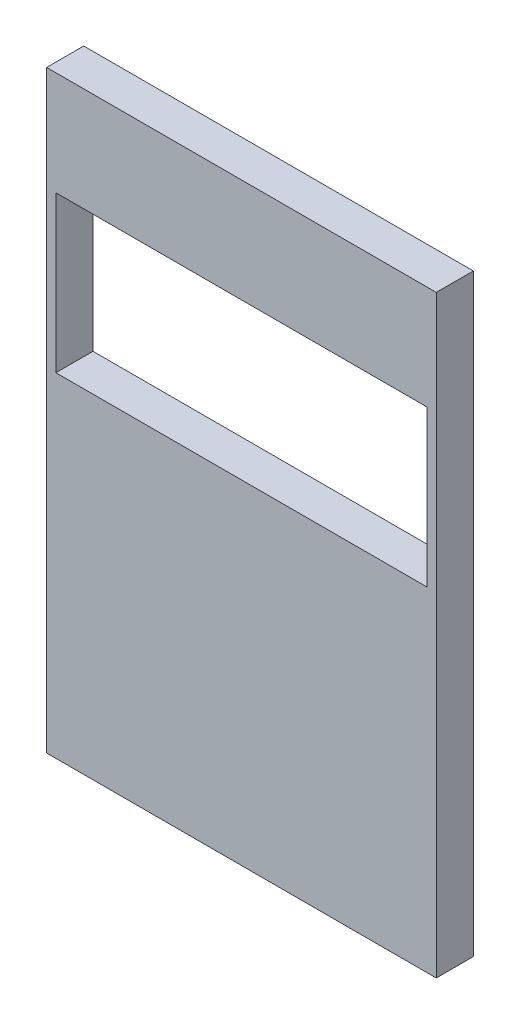
ISO-10303-21;
HEADER;
FILE_DESCRIPTION(('STEP AP214'),'2;1');
FILE_NAME('part.step','',(''),(''),'','','');
FILE_SCHEMA(('AUTOMOTIVE_DESIGN { 1 0 10303 214 1 1 1 1 }'));
ENDSEC;
DATA;
#1=APPLICATION_CONTEXT('core data for automotive mechanical design processes');
#2=APPLICATION_PROTOCOL_DEFINITION('international standard','automotive_design',2000,#1);
#3=PRODUCT_CONTEXT('',#1,'mechanical');
#4=PRODUCT('Part','Part','',(#3));
#5=PRODUCT_RELATED_PRODUCT_CATEGORY('part','',(#4));
#6=PRODUCT_DEFINITION_FORMATION('','',#4);
#7=PRODUCT_DEFINITION_CONTEXT('part definition',#1,'design');
#8=PRODUCT_DEFINITION('design','',#6,#7);
#9=PRODUCT_DEFINITION_SHAPE('','',#8);
#10=(LENGTH_UNIT() NAMED_UNIT(*) SI_UNIT(.MILLI.,.METRE.));
#11=(NAMED_UNIT(*) PLANE_ANGLE_UNIT() SI_UNIT($,.RADIAN.));
#12=(NAMED_UNIT(*) SI_UNIT($,.STERADIAN.) SOLID_ANGLE_UNIT());
#13=UNCERTAINTY_MEASURE_WITH_UNIT(LENGTH_MEASURE(1.E-05),#10,'distance_accuracy_value','');
#14=(GEOMETRIC_REPRESENTATION_CONTEXT(3) GLOBAL_UNCERTAINTY_ASSIGNED_CONTEXT((#13)) GLOBAL_UNIT_ASSIGNED_CONTEXT((#10,
#11,#12)) REPRESENTATION_CONTEXT('',''));
#15=CARTESIAN_POINT('',(0.,0.,0.));
#16=DIRECTION('',(0.,0.,1.));
#17=DIRECTION('',(1.,0.,0.));
#18=AXIS2_PLACEMENT_3D('',#15,#16,#17);
#19=CARTESIAN_POINT('',(-52.5,-80.,10.));
#20=DIRECTION('',(1.,0.,0.));
#21=DIRECTION('',(0.,0.,-1.));
#22=AXIS2_PLACEMENT_3D('',#19,#20,#21);
#23=PLANE('',#22);
#24=DIRECTION('',(0.,-1.,0.));
#25=VECTOR('',#24,1.);
#26=CARTESIAN_POINT('',(-52.5,-80.,0.));
#27=LINE('',#26,#25);
#28=CARTESIAN_POINT('',(-52.5,80.,0.));
#29=VERTEX_POINT('',#28);
#30=CARTESIAN_POINT('',(-52.5,-80.,0.));
#31=VERTEX_POINT('',#30);
#32=EDGE_CURVE('E130',#29,#31,#27,.T.);
#33=ORIENTED_EDGE('',*,*,#32,.T.);
#34=DIRECTION('',(0.,0.,-1.));
#35=VECTOR('',#34,1.);
#36=CARTESIAN_POINT('',(-52.5,-80.,10.));
#37=LINE('',#36,#35);
#38=CARTESIAN_POINT('',(-52.5,-80.,10.));
#39=VERTEX_POINT('',#38);
#40=EDGE_CURVE('E11',#39,#31,#37,.T.);
#41=ORIENTED_EDGE('',*,*,#40,.F.);
#42=DIRECTION('',(0.,-1.,0.));
#43=VECTOR('',#42,1.);
#44=CARTESIAN_POINT('',(-52.5,-80.,10.));
#45=LINE('',#44,#43);
#46=CARTESIAN_POINT('',(-52.5,80.,10.));
#47=VERTEX_POINT('',#46);
#48=EDGE_CURVE('E134',#47,#39,#45,.T.);
#49=ORIENTED_EDGE('',*,*,#48,.F.);
#50=DIRECTION('',(0.,0.,-1.));
#51=VECTOR('',#50,1.);
#52=CARTESIAN_POINT('',(-52.5,80.,10.));
#53=LINE('',#52,#51);
#54=EDGE_CURVE('E144',#47,#29,#53,.T.);
#55=ORIENTED_EDGE('',*,*,#54,.T.);
#56=EDGE_LOOP('',(#33,#41,#49,#55));
#57=FACE_BOUND('',#56,.T.);
#58=ADVANCED_FACE('F35',(#57),#23,.F.);
#59=CARTESIAN_POINT('',(52.5,-80.,10.));
#60=DIRECTION('',(0.,1.,0.));
#61=DIRECTION('',(-1.,0.,0.));
#62=AXIS2_PLACEMENT_3D('',#59,#60,#61);
#63=PLANE('',#62);
#64=DIRECTION('',(1.,0.,0.));
#65=VECTOR('',#64,1.);
#66=CARTESIAN_POINT('',(52.5,-80.,0.));
#67=LINE('',#66,#65);
#68=CARTESIAN_POINT('',(52.5,-80.,0.));
#69=VERTEX_POINT('',#68);
#70=EDGE_CURVE('E147',#31,#69,#67,.T.);
#71=ORIENTED_EDGE('',*,*,#70,.T.);
#72=DIRECTION('',(0.,0.,-1.));
#73=VECTOR('',#72,1.);
#74=CARTESIAN_POINT('',(52.5,-80.,10.));
#75=LINE('',#74,#73);
#76=CARTESIAN_POINT('',(52.5,-80.,10.));
#77=VERTEX_POINT('',#76);
#78=EDGE_CURVE('E42',#77,#69,#75,.T.);
#79=ORIENTED_EDGE('',*,*,#78,.F.);
#80=DIRECTION('',(1.,0.,0.));
#81=VECTOR('',#80,1.);
#82=CARTESIAN_POINT('',(52.5,-80.,10.));
#83=LINE('',#82,#81);
#84=EDGE_CURVE('E137',#39,#77,#83,.T.);
#85=ORIENTED_EDGE('',*,*,#84,.F.);
#86=ORIENTED_EDGE('',*,*,#40,.T.);
#87=EDGE_LOOP('',(#71,#79,#85,#86));
#88=FACE_BOUND('',#87,.T.);
#89=ADVANCED_FACE('F175',(#88),#63,.F.);
#90=CARTESIAN_POINT('',(52.5,-80.,10.));
#91=DIRECTION('',(-1.,0.,0.));
#92=DIRECTION('',(0.,0.,1.));
#93=AXIS2_PLACEMENT_3D('',#90,#91,#92);
#94=PLANE('',#93);
#95=DIRECTION('',(0.,1.,0.));
#96=VECTOR('',#95,1.);
#97=CARTESIAN_POINT('',(52.5,-80.,0.));
#98=LINE('',#97,#96);
#99=CARTESIAN_POINT('',(52.5,80.,0.));
#100=VERTEX_POINT('',#99);
#101=EDGE_CURVE('E149',#69,#100,#98,.T.);
#102=ORIENTED_EDGE('',*,*,#101,.T.);
#103=DIRECTION('',(0.,0.,-1.));
#104=VECTOR('',#103,1.);
#105=CARTESIAN_POINT('',(52.5,80.,10.));
#106=LINE('',#105,#104);
#107=CARTESIAN_POINT('',(52.5,80.,10.));
#108=VERTEX_POINT('',#107);
#109=EDGE_CURVE('E154',#108,#100,#106,.T.);
#110=ORIENTED_EDGE('',*,*,#109,.F.);
#111=DIRECTION('',(0.,1.,0.));
#112=VECTOR('',#111,1.);
#113=CARTESIAN_POINT('',(52.5,-80.,10.));
#114=LINE('',#113,#112);
#115=EDGE_CURVE('E140',#77,#108,#114,.T.);
#116=ORIENTED_EDGE('',*,*,#115,.F.);
#117=ORIENTED_EDGE('',*,*,#78,.T.);
#118=EDGE_LOOP('',(#102,#110,#116,#117));
#119=FACE_BOUND('',#118,.T.);
#120=ADVANCED_FACE('F161',(#119),#94,.F.);
#121=CARTESIAN_POINT('',(52.5,80.,10.));
#122=DIRECTION('',(0.,-1.,0.));
#123=DIRECTION('',(0.,0.,-1.));
#124=AXIS2_PLACEMENT_3D('',#121,#122,#123);
#125=PLANE('',#124);
#126=DIRECTION('',(-1.,0.,0.));
#127=VECTOR('',#126,1.);
#128=CARTESIAN_POINT('',(52.5,80.,0.));
#129=LINE('',#128,#127);
#130=EDGE_CURVE('E138',#100,#29,#129,.T.);
#131=ORIENTED_EDGE('',*,*,#130,.T.);
#132=ORIENTED_EDGE('',*,*,#54,.F.);
#133=DIRECTION('',(-1.,0.,0.));
#134=VECTOR('',#133,1.);
#135=CARTESIAN_POINT('',(52.5,80.,10.));
#136=LINE('',#135,#134);
#137=EDGE_CURVE('E142',#108,#47,#136,.T.);
#138=ORIENTED_EDGE('',*,*,#137,.F.);
#139=ORIENTED_EDGE('',*,*,#109,.T.);
#140=EDGE_LOOP('',(#131,#132,#138,#139));
#141=FACE_BOUND('',#140,.T.);
#142=ADVANCED_FACE('F170',(#141),#125,.F.);
#143=CARTESIAN_POINT('',(0.,0.,10.));
#144=DIRECTION('',(0.,0.,1.));
#145=DIRECTION('',(1.,0.,0.));
#146=AXIS2_PLACEMENT_3D('',#143,#144,#145);
#147=PLANE('',#146);
#148=DIRECTION('',(0.,1.,0.));
#149=VECTOR('',#148,1.);
#150=CARTESIAN_POINT('',(-50.,10.,10.));
#151=LINE('',#150,#149);
#152=CARTESIAN_POINT('',(-50.,10.,10.));
#153=VERTEX_POINT('',#152);
#154=CARTESIAN_POINT('',(-50.,52.,10.));
#155=VERTEX_POINT('',#154);
#156=EDGE_CURVE('E101',#153,#155,#151,.T.);
#157=ORIENTED_EDGE('',*,*,#156,.T.);
#158=DIRECTION('',(1.,0.,0.));
#159=VECTOR('',#158,1.);
#160=CARTESIAN_POINT('',(-50.,52.,10.));
#161=LINE('',#160,#159);
#162=CARTESIAN_POINT('',(50.,52.,10.));
#163=VERTEX_POINT('',#162);
#164=EDGE_CURVE('E107',#155,#163,#161,.T.);
#165=ORIENTED_EDGE('',*,*,#164,.T.);
#166=DIRECTION('',(0.,1.,0.));
#167=VECTOR('',#166,1.);
#168=CARTESIAN_POINT('',(50.,9.99999999999998,10.));
#169=LINE('',#168,#167);
#170=CARTESIAN_POINT('',(50.,9.99999999999998,10.));
#171=VERTEX_POINT('',#170);
#172=EDGE_CURVE('E111',#171,#163,#169,.T.);
#173=ORIENTED_EDGE('',*,*,#172,.F.);
#174=DIRECTION('',(1.,0.,0.));
#175=VECTOR('',#174,1.);
#176=CARTESIAN_POINT('',(-50.,10.,10.));
#177=LINE('',#176,#175);
#178=EDGE_CURVE('E104',#153,#171,#177,.T.);
#179=ORIENTED_EDGE('',*,*,#178,.F.);
#180=EDGE_LOOP('',(#157,#165,#173,#179));
#181=FACE_BOUND('',#180,.T.);
#182=ORIENTED_EDGE('',*,*,#48,.T.);
#183=ORIENTED_EDGE('',*,*,#84,.T.);
#184=ORIENTED_EDGE('',*,*,#115,.T.);
#185=ORIENTED_EDGE('',*,*,#137,.T.);
#186=EDGE_LOOP('',(#182,#183,#184,#185));
#187=FACE_BOUND('',#186,.T.);
#188=ADVANCED_FACE('F113',(#181,#187),#147,.T.);
#189=CARTESIAN_POINT('',(0.,0.,0.));
#190=DIRECTION('',(0.,0.,1.));
#191=DIRECTION('',(1.,0.,0.));
#192=AXIS2_PLACEMENT_3D('',#189,#190,#191);
#193=PLANE('',#192);
#194=DIRECTION('',(1.,0.,0.));
#195=VECTOR('',#194,1.);
#196=CARTESIAN_POINT('',(-50.,52.,0.));
#197=LINE('',#196,#195);
#198=CARTESIAN_POINT('',(-50.,52.,0.));
#199=VERTEX_POINT('',#198);
#200=CARTESIAN_POINT('',(50.,52.,0.));
#201=VERTEX_POINT('',#200);
#202=EDGE_CURVE('E124',#199,#201,#197,.T.);
#203=ORIENTED_EDGE('',*,*,#202,.F.);
#204=DIRECTION('',(0.,1.,0.));
#205=VECTOR('',#204,1.);
#206=CARTESIAN_POINT('',(-50.,10.,0.));
#207=LINE('',#206,#205);
#208=CARTESIAN_POINT('',(-50.,10.,0.));
#209=VERTEX_POINT('',#208);
#210=EDGE_CURVE('E57',#209,#199,#207,.T.);
#211=ORIENTED_EDGE('',*,*,#210,.F.);
#212=DIRECTION('',(1.,0.,0.));
#213=VECTOR('',#212,1.);
#214=CARTESIAN_POINT('',(-50.,10.,0.));
#215=LINE('',#214,#213);
#216=CARTESIAN_POINT('',(50.,9.99999999999998,0.));
#217=VERTEX_POINT('',#216);
#218=EDGE_CURVE('E115',#209,#217,#215,.T.);
#219=ORIENTED_EDGE('',*,*,#218,.T.);
#220=DIRECTION('',(0.,1.,0.));
#221=VECTOR('',#220,1.);
#222=CARTESIAN_POINT('',(50.,9.99999999999998,0.));
#223=LINE('',#222,#221);
#224=EDGE_CURVE('E118',#217,#201,#223,.T.);
#225=ORIENTED_EDGE('',*,*,#224,.T.);
#226=EDGE_LOOP('',(#203,#211,#219,#225));
#227=FACE_BOUND('',#226,.T.);
#228=ORIENTED_EDGE('',*,*,#32,.F.);
#229=ORIENTED_EDGE('',*,*,#130,.F.);
#230=ORIENTED_EDGE('',*,*,#101,.F.);
#231=ORIENTED_EDGE('',*,*,#70,.F.);
#232=EDGE_LOOP('',(#228,#229,#230,#231));
#233=FACE_BOUND('',#232,.T.);
#234=ADVANCED_FACE('F167',(#227,#233),#193,.F.);
#235=CARTESIAN_POINT('',(-50.,10.,10.));
#236=DIRECTION('',(-1.,0.,0.));
#237=DIRECTION('',(0.,0.,1.));
#238=AXIS2_PLACEMENT_3D('',#235,#236,#237);
#239=PLANE('',#238);
#240=ORIENTED_EDGE('',*,*,#210,.T.);
#241=DIRECTION('',(0.,0.,-1.));
#242=VECTOR('',#241,1.);
#243=CARTESIAN_POINT('',(-50.,52.,10.));
#244=LINE('',#243,#242);
#245=EDGE_CURVE('E98',#155,#199,#244,.T.);
#246=ORIENTED_EDGE('',*,*,#245,.F.);
#247=ORIENTED_EDGE('',*,*,#156,.F.);
#248=DIRECTION('',(0.,0.,-1.));
#249=VECTOR('',#248,1.);
#250=CARTESIAN_POINT('',(-50.,10.,10.));
#251=LINE('',#250,#249);
#252=EDGE_CURVE('E128',#153,#209,#251,.T.);
#253=ORIENTED_EDGE('',*,*,#252,.T.);
#254=EDGE_LOOP('',(#240,#246,#247,#253));
#255=FACE_BOUND('',#254,.T.);
#256=ADVANCED_FACE('F99',(#255),#239,.F.);
#257=CARTESIAN_POINT('',(-50.,10.,10.));
#258=DIRECTION('',(0.,1.,0.));
#259=DIRECTION('',(-1.,0.,0.));
#260=AXIS2_PLACEMENT_3D('',#257,#258,#259);
#261=PLANE('',#260);
#262=ORIENTED_EDGE('',*,*,#218,.F.);
#263=ORIENTED_EDGE('',*,*,#252,.F.);
#264=ORIENTED_EDGE('',*,*,#178,.T.);
#265=DIRECTION('',(0.,0.,-1.));
#266=VECTOR('',#265,1.);
#267=CARTESIAN_POINT('',(50.,9.99999999999998,10.));
#268=LINE('',#267,#266);
#269=EDGE_CURVE('E131',#171,#217,#268,.T.);
#270=ORIENTED_EDGE('',*,*,#269,.T.);
#271=EDGE_LOOP('',(#262,#263,#264,#270));
#272=FACE_BOUND('',#271,.T.);
#273=ADVANCED_FACE('F192',(#272),#261,.T.);
#274=CARTESIAN_POINT('',(50.,9.99999999999998,10.));
#275=DIRECTION('',(-1.,0.,0.));
#276=DIRECTION('',(0.,0.,1.));
#277=AXIS2_PLACEMENT_3D('',#274,#275,#276);
#278=PLANE('',#277);
#279=ORIENTED_EDGE('',*,*,#224,.F.);
#280=ORIENTED_EDGE('',*,*,#269,.F.);
#281=ORIENTED_EDGE('',*,*,#172,.T.);
#282=DIRECTION('',(0.,0.,-1.));
#283=VECTOR('',#282,1.);
#284=CARTESIAN_POINT('',(50.,52.,10.));
#285=LINE('',#284,#283);
#286=EDGE_CURVE('E49',#163,#201,#285,.T.);
#287=ORIENTED_EDGE('',*,*,#286,.T.);
#288=EDGE_LOOP('',(#279,#280,#281,#287));
#289=FACE_BOUND('',#288,.T.);
#290=ADVANCED_FACE('F195',(#289),#278,.T.);
#291=CARTESIAN_POINT('',(-50.,52.,10.));
#292=DIRECTION('',(0.,1.,0.));
#293=DIRECTION('',(-1.,0.,0.));
#294=AXIS2_PLACEMENT_3D('',#291,#292,#293);
#295=PLANE('',#294);
#296=ORIENTED_EDGE('',*,*,#202,.T.);
#297=ORIENTED_EDGE('',*,*,#286,.F.);
#298=ORIENTED_EDGE('',*,*,#164,.F.);
#299=ORIENTED_EDGE('',*,*,#245,.T.);
#300=EDGE_LOOP('',(#296,#297,#298,#299));
#301=FACE_BOUND('',#300,.T.);
#302=ADVANCED_FACE('F108',(#301),#295,.F.);
#303=CLOSED_SHELL('',(#58,#89,#120,#142,#188,#234,#256,#273,#290,#302));
#304=MANIFOLD_SOLID_BREP('B2',#303);
#305=ADVANCED_BREP_SHAPE_REPRESENTATION('',(#18,#304),#14);
#306=SHAPE_DEFINITION_REPRESENTATION(#9,#305);
ENDSEC;
END-ISO-10303-21;
